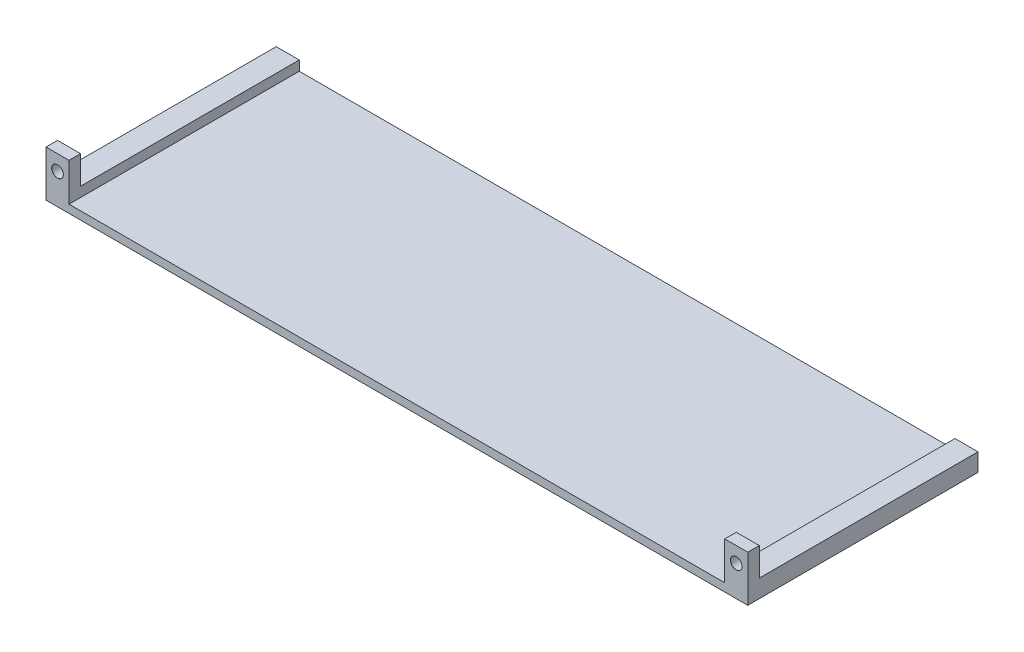
ISO-10303-21;
HEADER;
FILE_DESCRIPTION(('STEP AP214'),'2;1');
FILE_NAME('part.step','',(''),(''),'','','');
FILE_SCHEMA(('AUTOMOTIVE_DESIGN { 1 0 10303 214 1 1 1 1 }'));
ENDSEC;
DATA;
#1=APPLICATION_CONTEXT('core data for automotive mechanical design processes');
#2=APPLICATION_PROTOCOL_DEFINITION('international standard','automotive_design',2000,#1);
#3=PRODUCT_CONTEXT('',#1,'mechanical');
#4=PRODUCT('Part','Part','',(#3));
#5=PRODUCT_RELATED_PRODUCT_CATEGORY('part','',(#4));
#6=PRODUCT_DEFINITION_FORMATION('','',#4);
#7=PRODUCT_DEFINITION_CONTEXT('part definition',#1,'design');
#8=PRODUCT_DEFINITION('design','',#6,#7);
#9=PRODUCT_DEFINITION_SHAPE('','',#8);
#10=(LENGTH_UNIT() NAMED_UNIT(*) SI_UNIT(.MILLI.,.METRE.));
#11=(NAMED_UNIT(*) PLANE_ANGLE_UNIT() SI_UNIT($,.RADIAN.));
#12=(NAMED_UNIT(*) SI_UNIT($,.STERADIAN.) SOLID_ANGLE_UNIT());
#13=UNCERTAINTY_MEASURE_WITH_UNIT(LENGTH_MEASURE(1.E-05),#10,'distance_accuracy_value','');
#14=(GEOMETRIC_REPRESENTATION_CONTEXT(3) GLOBAL_UNCERTAINTY_ASSIGNED_CONTEXT((#13)) GLOBAL_UNIT_ASSIGNED_CONTEXT((#10,
#11,#12)) REPRESENTATION_CONTEXT('',''));
#15=CARTESIAN_POINT('',(0.,0.,0.));
#16=DIRECTION('',(0.,0.,1.));
#17=DIRECTION('',(1.,0.,0.));
#18=AXIS2_PLACEMENT_3D('',#15,#16,#17);
#19=CARTESIAN_POINT('',(0.,0.,-100.));
#20=DIRECTION('',(0.,0.,1.));
#21=DIRECTION('',(1.,0.,0.));
#22=AXIS2_PLACEMENT_3D('',#19,#20,#21);
#23=PLANE('',#22);
#24=DIRECTION('',(-1.,0.,0.));
#25=VECTOR('',#24,1.);
#26=CARTESIAN_POINT('',(-142.4,-36.4899999999999,-100.));
#27=LINE('',#26,#25);
#28=CARTESIAN_POINT('',(-142.4,-36.4899999999999,-100.));
#29=VERTEX_POINT('',#28);
#30=CARTESIAN_POINT('',(-152.4,-36.4899999999999,-100.));
#31=VERTEX_POINT('',#30);
#32=EDGE_CURVE('E133',#29,#31,#27,.T.);
#33=ORIENTED_EDGE('',*,*,#32,.F.);
#34=DIRECTION('',(0.,1.,0.));
#35=VECTOR('',#34,1.);
#36=CARTESIAN_POINT('',(-142.4,0.,-100.));
#37=LINE('',#36,#35);
#38=CARTESIAN_POINT('',(-142.4,-40.74,-100.));
#39=VERTEX_POINT('',#38);
#40=EDGE_CURVE('E144',#39,#29,#37,.T.);
#41=ORIENTED_EDGE('',*,*,#40,.F.);
#42=DIRECTION('',(1.,0.,0.));
#43=VECTOR('',#42,1.);
#44=CARTESIAN_POINT('',(0.,-40.74,-100.));
#45=LINE('',#44,#43);
#46=CARTESIAN_POINT('',(142.4,-40.7399999999999,-100.));
#47=VERTEX_POINT('',#46);
#48=EDGE_CURVE('E154',#39,#47,#45,.T.);
#49=ORIENTED_EDGE('',*,*,#48,.T.);
#50=DIRECTION('',(0.,1.,0.));
#51=VECTOR('',#50,1.);
#52=CARTESIAN_POINT('',(142.4,0.,-100.));
#53=LINE('',#52,#51);
#54=CARTESIAN_POINT('',(142.4,-36.4899999999999,-100.));
#55=VERTEX_POINT('',#54);
#56=EDGE_CURVE('E158',#47,#55,#53,.T.);
#57=ORIENTED_EDGE('',*,*,#56,.T.);
#58=DIRECTION('',(1.,0.,0.));
#59=VECTOR('',#58,1.);
#60=CARTESIAN_POINT('',(142.4,-36.4899999999999,-100.));
#61=LINE('',#60,#59);
#62=CARTESIAN_POINT('',(152.4,-36.4899999999999,-100.));
#63=VERTEX_POINT('',#62);
#64=EDGE_CURVE('E198',#55,#63,#61,.T.);
#65=ORIENTED_EDGE('',*,*,#64,.T.);
#66=DIRECTION('',(0.,1.,0.));
#67=VECTOR('',#66,1.);
#68=CARTESIAN_POINT('',(152.4,0.,-100.));
#69=LINE('',#68,#67);
#70=CARTESIAN_POINT('',(152.4,-44.2399999999999,-100.));
#71=VERTEX_POINT('',#70);
#72=EDGE_CURVE('E228',#71,#63,#69,.T.);
#73=ORIENTED_EDGE('',*,*,#72,.F.);
#74=DIRECTION('',(1.,0.,0.));
#75=VECTOR('',#74,1.);
#76=CARTESIAN_POINT('',(0.,-44.24,-100.));
#77=LINE('',#76,#75);
#78=CARTESIAN_POINT('',(-152.4,-44.24,-100.));
#79=VERTEX_POINT('',#78);
#80=EDGE_CURVE('E225',#79,#71,#77,.T.);
#81=ORIENTED_EDGE('',*,*,#80,.F.);
#82=DIRECTION('',(0.,1.,0.));
#83=VECTOR('',#82,1.);
#84=CARTESIAN_POINT('',(-152.4,0.,-100.));
#85=LINE('',#84,#83);
#86=EDGE_CURVE('E147',#79,#31,#85,.T.);
#87=ORIENTED_EDGE('',*,*,#86,.T.);
#88=EDGE_LOOP('',(#33,#41,#49,#57,#65,#73,#81,#87));
#89=FACE_BOUND('',#88,.T.);
#90=ADVANCED_FACE('F41',(#89),#23,.F.);
#91=CARTESIAN_POINT('',(-152.4,0.,-100.));
#92=DIRECTION('',(1.,0.,0.));
#93=DIRECTION('',(0.,0.,-1.));
#94=AXIS2_PLACEMENT_3D('',#91,#92,#93);
#95=PLANE('',#94);
#96=DIRECTION('',(0.,-1.,0.));
#97=VECTOR('',#96,1.);
#98=CARTESIAN_POINT('',(-152.4,-24.24,-5.));
#99=LINE('',#98,#97);
#100=CARTESIAN_POINT('',(-152.4,-24.24,-5.));
#101=VERTEX_POINT('',#100);
#102=CARTESIAN_POINT('',(-152.4,-36.49,-5.));
#103=VERTEX_POINT('',#102);
#104=EDGE_CURVE('E139',#101,#103,#99,.T.);
#105=ORIENTED_EDGE('',*,*,#104,.T.);
#106=DIRECTION('',(0.,0.,-1.));
#107=VECTOR('',#106,1.);
#108=CARTESIAN_POINT('',(-152.4,-36.4899999999999,-100.));
#109=LINE('',#108,#107);
#110=EDGE_CURVE('E257',#103,#31,#109,.T.);
#111=ORIENTED_EDGE('',*,*,#110,.T.);
#112=ORIENTED_EDGE('',*,*,#86,.F.);
#113=DIRECTION('',(0.,0.,1.));
#114=VECTOR('',#113,1.);
#115=CARTESIAN_POINT('',(-152.4,-44.24,-100.));
#116=LINE('',#115,#114);
#117=CARTESIAN_POINT('',(-152.4,-44.24,0.));
#118=VERTEX_POINT('',#117);
#119=EDGE_CURVE('E153',#79,#118,#116,.T.);
#120=ORIENTED_EDGE('',*,*,#119,.T.);
#121=DIRECTION('',(0.,1.,0.));
#122=VECTOR('',#121,1.);
#123=CARTESIAN_POINT('',(-152.4,0.,0.));
#124=LINE('',#123,#122);
#125=CARTESIAN_POINT('',(-152.4,-24.24,0.));
#126=VERTEX_POINT('',#125);
#127=EDGE_CURVE('E162',#118,#126,#124,.T.);
#128=ORIENTED_EDGE('',*,*,#127,.T.);
#129=DIRECTION('',(0.,0.,1.));
#130=VECTOR('',#129,1.);
#131=CARTESIAN_POINT('',(-152.4,-24.24,-100.));
#132=LINE('',#131,#130);
#133=EDGE_CURVE('E11',#101,#126,#132,.T.);
#134=ORIENTED_EDGE('',*,*,#133,.F.);
#135=EDGE_LOOP('',(#105,#111,#112,#120,#128,#134));
#136=FACE_BOUND('',#135,.T.);
#137=ADVANCED_FACE('F43',(#136),#95,.F.);
#138=CARTESIAN_POINT('',(0.,-24.24,-100.));
#139=DIRECTION('',(0.,-1.,0.));
#140=DIRECTION('',(0.,0.,-1.));
#141=AXIS2_PLACEMENT_3D('',#138,#139,#140);
#142=PLANE('',#141);
#143=DIRECTION('',(-1.,0.,0.));
#144=VECTOR('',#143,1.);
#145=CARTESIAN_POINT('',(-142.4,-24.24,-5.));
#146=LINE('',#145,#144);
#147=CARTESIAN_POINT('',(-142.4,-24.24,-5.));
#148=VERTEX_POINT('',#147);
#149=EDGE_CURVE('E245',#148,#101,#146,.T.);
#150=ORIENTED_EDGE('',*,*,#149,.T.);
#151=ORIENTED_EDGE('',*,*,#133,.T.);
#152=DIRECTION('',(1.,0.,0.));
#153=VECTOR('',#152,1.);
#154=CARTESIAN_POINT('',(0.,-24.24,0.));
#155=LINE('',#154,#153);
#156=CARTESIAN_POINT('',(-142.4,-24.24,0.));
#157=VERTEX_POINT('',#156);
#158=EDGE_CURVE('E183',#126,#157,#155,.T.);
#159=ORIENTED_EDGE('',*,*,#158,.T.);
#160=DIRECTION('',(0.,0.,1.));
#161=VECTOR('',#160,1.);
#162=CARTESIAN_POINT('',(-142.4,-24.24,-100.));
#163=LINE('',#162,#161);
#164=EDGE_CURVE('E50',#148,#157,#163,.T.);
#165=ORIENTED_EDGE('',*,*,#164,.F.);
#166=EDGE_LOOP('',(#150,#151,#159,#165));
#167=FACE_BOUND('',#166,.T.);
#168=ADVANCED_FACE('F261',(#167),#142,.F.);
#169=CARTESIAN_POINT('',(-142.4,0.,-100.));
#170=DIRECTION('',(1.,0.,0.));
#171=DIRECTION('',(0.,0.,-1.));
#172=AXIS2_PLACEMENT_3D('',#169,#170,#171);
#173=PLANE('',#172);
#174=DIRECTION('',(0.,0.,-1.));
#175=VECTOR('',#174,1.);
#176=CARTESIAN_POINT('',(-142.4,-36.4899999999999,-100.));
#177=LINE('',#176,#175);
#178=CARTESIAN_POINT('',(-142.4,-36.49,-5.));
#179=VERTEX_POINT('',#178);
#180=EDGE_CURVE('E130',#179,#29,#177,.T.);
#181=ORIENTED_EDGE('',*,*,#180,.F.);
#182=DIRECTION('',(0.,-1.,0.));
#183=VECTOR('',#182,1.);
#184=CARTESIAN_POINT('',(-142.4,-24.24,-5.));
#185=LINE('',#184,#183);
#186=EDGE_CURVE('E138',#148,#179,#185,.T.);
#187=ORIENTED_EDGE('',*,*,#186,.F.);
#188=ORIENTED_EDGE('',*,*,#164,.T.);
#189=DIRECTION('',(0.,1.,0.));
#190=VECTOR('',#189,1.);
#191=CARTESIAN_POINT('',(-142.4,0.,0.));
#192=LINE('',#191,#190);
#193=CARTESIAN_POINT('',(-142.4,-40.74,0.));
#194=VERTEX_POINT('',#193);
#195=EDGE_CURVE('E180',#194,#157,#192,.T.);
#196=ORIENTED_EDGE('',*,*,#195,.F.);
#197=DIRECTION('',(0.,0.,1.));
#198=VECTOR('',#197,1.);
#199=CARTESIAN_POINT('',(-142.4,-40.74,-100.));
#200=LINE('',#199,#198);
#201=EDGE_CURVE('E151',#39,#194,#200,.T.);
#202=ORIENTED_EDGE('',*,*,#201,.F.);
#203=ORIENTED_EDGE('',*,*,#40,.T.);
#204=EDGE_LOOP('',(#181,#187,#188,#196,#202,#203));
#205=FACE_BOUND('',#204,.T.);
#206=ADVANCED_FACE('F149',(#205),#173,.T.);
#207=CARTESIAN_POINT('',(-147.4,-30.9066666666667,0.));
#208=DIRECTION('',(0.,0.,1.));
#209=DIRECTION('',(1.,0.,0.));
#210=AXIS2_PLACEMENT_3D('',#207,#208,#209);
#211=CYLINDRICAL_SURFACE('',#210,2.49999999999999);
#212=CARTESIAN_POINT('',(-147.4,-30.9066666666667,-0.025));
#213=DIRECTION('',(0.,0.,1.));
#214=DIRECTION('',(1.,0.,0.));
#215=AXIS2_PLACEMENT_3D('',#212,#213,#214);
#216=CIRCLE('',#215,2.5);
#217=CARTESIAN_POINT('',(-144.9,-30.9066666666667,-0.025));
#218=VERTEX_POINT('',#217);
#219=EDGE_CURVE('E202',#218,#218,#216,.T.);
#220=ORIENTED_EDGE('',*,*,#219,.T.);
#221=EDGE_LOOP('',(#220));
#222=FACE_BOUND('',#221,.T.);
#223=CARTESIAN_POINT('',(-147.4,-30.9066666666667,-5.));
#224=DIRECTION('',(0.,0.,-1.));
#225=DIRECTION('',(-1.,0.,0.));
#226=AXIS2_PLACEMENT_3D('',#223,#224,#225);
#227=CIRCLE('',#226,2.49999999999999);
#228=CARTESIAN_POINT('',(-149.9,-30.9066666666667,-5.));
#229=VERTEX_POINT('',#228);
#230=EDGE_CURVE('E45',#229,#229,#227,.F.);
#231=ORIENTED_EDGE('',*,*,#230,.F.);
#232=EDGE_LOOP('',(#231));
#233=FACE_BOUND('',#232,.T.);
#234=ADVANCED_FACE('F270',(#222,#233),#211,.F.);
#235=CARTESIAN_POINT('',(0.,-40.74,-100.));
#236=DIRECTION('',(0.,-1.,0.));
#237=DIRECTION('',(1.,0.,0.));
#238=AXIS2_PLACEMENT_3D('',#235,#236,#237);
#239=PLANE('',#238);
#240=DIRECTION('',(1.,0.,0.));
#241=VECTOR('',#240,1.);
#242=CARTESIAN_POINT('',(0.,-40.74,0.));
#243=LINE('',#242,#241);
#244=CARTESIAN_POINT('',(142.4,-40.7399999999999,0.));
#245=VERTEX_POINT('',#244);
#246=EDGE_CURVE('E178',#194,#245,#243,.T.);
#247=ORIENTED_EDGE('',*,*,#246,.T.);
#248=DIRECTION('',(0.,0.,1.));
#249=VECTOR('',#248,1.);
#250=CARTESIAN_POINT('',(142.4,-40.7399999999999,-100.));
#251=LINE('',#250,#249);
#252=EDGE_CURVE('E188',#47,#245,#251,.T.);
#253=ORIENTED_EDGE('',*,*,#252,.F.);
#254=ORIENTED_EDGE('',*,*,#48,.F.);
#255=ORIENTED_EDGE('',*,*,#201,.T.);
#256=EDGE_LOOP('',(#247,#253,#254,#255));
#257=FACE_BOUND('',#256,.T.);
#258=ADVANCED_FACE('F268',(#257),#239,.F.);
#259=CARTESIAN_POINT('',(142.4,0.,-100.));
#260=DIRECTION('',(1.,0.,0.));
#261=DIRECTION('',(0.,0.,-1.));
#262=AXIS2_PLACEMENT_3D('',#259,#260,#261);
#263=PLANE('',#262);
#264=DIRECTION('',(0.,-1.,0.));
#265=VECTOR('',#264,1.);
#266=CARTESIAN_POINT('',(142.4,-24.24,-5.));
#267=LINE('',#266,#265);
#268=CARTESIAN_POINT('',(142.4,-24.24,-5.));
#269=VERTEX_POINT('',#268);
#270=CARTESIAN_POINT('',(142.4,-36.49,-5.));
#271=VERTEX_POINT('',#270);
#272=EDGE_CURVE('E238',#269,#271,#267,.T.);
#273=ORIENTED_EDGE('',*,*,#272,.T.);
#274=DIRECTION('',(0.,0.,-1.));
#275=VECTOR('',#274,1.);
#276=CARTESIAN_POINT('',(142.4,-36.4899999999999,-100.));
#277=LINE('',#276,#275);
#278=EDGE_CURVE('E215',#271,#55,#277,.T.);
#279=ORIENTED_EDGE('',*,*,#278,.T.);
#280=ORIENTED_EDGE('',*,*,#56,.F.);
#281=ORIENTED_EDGE('',*,*,#252,.T.);
#282=DIRECTION('',(0.,1.,0.));
#283=VECTOR('',#282,1.);
#284=CARTESIAN_POINT('',(142.4,0.,0.));
#285=LINE('',#284,#283);
#286=CARTESIAN_POINT('',(142.4,-24.2399999999999,0.));
#287=VERTEX_POINT('',#286);
#288=EDGE_CURVE('E175',#245,#287,#285,.T.);
#289=ORIENTED_EDGE('',*,*,#288,.T.);
#290=DIRECTION('',(0.,0.,1.));
#291=VECTOR('',#290,1.);
#292=CARTESIAN_POINT('',(142.4,-24.2399999999999,-100.));
#293=LINE('',#292,#291);
#294=EDGE_CURVE('E191',#269,#287,#293,.T.);
#295=ORIENTED_EDGE('',*,*,#294,.F.);
#296=EDGE_LOOP('',(#273,#279,#280,#281,#289,#295));
#297=FACE_BOUND('',#296,.T.);
#298=ADVANCED_FACE('F234',(#297),#263,.F.);
#299=CARTESIAN_POINT('',(0.,-24.2399999999999,-100.));
#300=DIRECTION('',(0.,1.,0.));
#301=DIRECTION('',(-1.,0.,0.));
#302=AXIS2_PLACEMENT_3D('',#299,#300,#301);
#303=PLANE('',#302);
#304=DIRECTION('',(1.,0.,0.));
#305=VECTOR('',#304,1.);
#306=CARTESIAN_POINT('',(142.4,-24.24,-5.));
#307=LINE('',#306,#305);
#308=CARTESIAN_POINT('',(152.4,-24.2399999999999,-5.));
#309=VERTEX_POINT('',#308);
#310=EDGE_CURVE('E66',#269,#309,#307,.T.);
#311=ORIENTED_EDGE('',*,*,#310,.F.);
#312=ORIENTED_EDGE('',*,*,#294,.T.);
#313=DIRECTION('',(-1.,0.,0.));
#314=VECTOR('',#313,1.);
#315=CARTESIAN_POINT('',(0.,-24.2399999999999,0.));
#316=LINE('',#315,#314);
#317=CARTESIAN_POINT('',(152.4,-24.2399999999999,0.));
#318=VERTEX_POINT('',#317);
#319=EDGE_CURVE('E172',#318,#287,#316,.T.);
#320=ORIENTED_EDGE('',*,*,#319,.F.);
#321=DIRECTION('',(0.,0.,1.));
#322=VECTOR('',#321,1.);
#323=CARTESIAN_POINT('',(152.4,-24.2399999999999,-100.));
#324=LINE('',#323,#322);
#325=EDGE_CURVE('E193',#309,#318,#324,.T.);
#326=ORIENTED_EDGE('',*,*,#325,.F.);
#327=EDGE_LOOP('',(#311,#312,#320,#326));
#328=FACE_BOUND('',#327,.T.);
#329=ADVANCED_FACE('F276',(#328),#303,.T.);
#330=CARTESIAN_POINT('',(152.4,0.,-100.));
#331=DIRECTION('',(1.,0.,0.));
#332=DIRECTION('',(0.,0.,-1.));
#333=AXIS2_PLACEMENT_3D('',#330,#331,#332);
#334=PLANE('',#333);
#335=DIRECTION('',(0.,0.,-1.));
#336=VECTOR('',#335,1.);
#337=CARTESIAN_POINT('',(152.4,-36.4899999999999,-100.));
#338=LINE('',#337,#336);
#339=CARTESIAN_POINT('',(152.4,-36.49,-5.));
#340=VERTEX_POINT('',#339);
#341=EDGE_CURVE('E212',#340,#63,#338,.T.);
#342=ORIENTED_EDGE('',*,*,#341,.F.);
#343=DIRECTION('',(0.,-1.,0.));
#344=VECTOR('',#343,1.);
#345=CARTESIAN_POINT('',(152.4,-24.24,-5.));
#346=LINE('',#345,#344);
#347=EDGE_CURVE('E242',#309,#340,#346,.T.);
#348=ORIENTED_EDGE('',*,*,#347,.F.);
#349=ORIENTED_EDGE('',*,*,#325,.T.);
#350=DIRECTION('',(0.,1.,0.));
#351=VECTOR('',#350,1.);
#352=CARTESIAN_POINT('',(152.4,0.,0.));
#353=LINE('',#352,#351);
#354=CARTESIAN_POINT('',(152.4,-44.2399999999999,0.));
#355=VERTEX_POINT('',#354);
#356=EDGE_CURVE('E169',#355,#318,#353,.T.);
#357=ORIENTED_EDGE('',*,*,#356,.F.);
#358=DIRECTION('',(0.,0.,1.));
#359=VECTOR('',#358,1.);
#360=CARTESIAN_POINT('',(152.4,-44.2399999999999,-100.));
#361=LINE('',#360,#359);
#362=EDGE_CURVE('E156',#71,#355,#361,.T.);
#363=ORIENTED_EDGE('',*,*,#362,.F.);
#364=ORIENTED_EDGE('',*,*,#72,.T.);
#365=EDGE_LOOP('',(#342,#348,#349,#357,#363,#364));
#366=FACE_BOUND('',#365,.T.);
#367=ADVANCED_FACE('F421',(#366),#334,.T.);
#368=CARTESIAN_POINT('',(0.,-44.24,-100.));
#369=DIRECTION('',(0.,-1.,0.));
#370=DIRECTION('',(1.,0.,0.));
#371=AXIS2_PLACEMENT_3D('',#368,#369,#370);
#372=PLANE('',#371);
#373=DIRECTION('',(1.,0.,0.));
#374=VECTOR('',#373,1.);
#375=CARTESIAN_POINT('',(0.,-44.24,0.));
#376=LINE('',#375,#374);
#377=EDGE_CURVE('E165',#118,#355,#376,.T.);
#378=ORIENTED_EDGE('',*,*,#377,.F.);
#379=ORIENTED_EDGE('',*,*,#119,.F.);
#380=ORIENTED_EDGE('',*,*,#80,.T.);
#381=ORIENTED_EDGE('',*,*,#362,.T.);
#382=EDGE_LOOP('',(#378,#379,#380,#381));
#383=FACE_BOUND('',#382,.T.);
#384=ADVANCED_FACE('F333',(#383),#372,.T.);
#385=CARTESIAN_POINT('',(0.,0.,0.));
#386=DIRECTION('',(0.,0.,1.));
#387=DIRECTION('',(1.,0.,0.));
#388=AXIS2_PLACEMENT_3D('',#385,#386,#387);
#389=PLANE('',#388);
#390=CARTESIAN_POINT('',(-147.4,-30.9066666666667,0.));
#391=DIRECTION('',(0.,0.,1.));
#392=DIRECTION('',(1.,0.,0.));
#393=AXIS2_PLACEMENT_3D('',#390,#391,#392);
#394=CIRCLE('',#393,2.525);
#395=CARTESIAN_POINT('',(-144.875,-30.9066666666667,0.));
#396=VERTEX_POINT('',#395);
#397=EDGE_CURVE('E197',#396,#396,#394,.T.);
#398=ORIENTED_EDGE('',*,*,#397,.F.);
#399=EDGE_LOOP('',(#398));
#400=FACE_BOUND('',#399,.T.);
#401=CARTESIAN_POINT('',(147.4,-30.9066666666663,0.));
#402=DIRECTION('',(0.,0.,1.));
#403=DIRECTION('',(1.,0.,0.));
#404=AXIS2_PLACEMENT_3D('',#401,#402,#403);
#405=CIRCLE('',#404,2.525);
#406=CARTESIAN_POINT('',(149.925,-30.9066666666663,0.));
#407=VERTEX_POINT('',#406);
#408=EDGE_CURVE('E219',#407,#407,#405,.T.);
#409=ORIENTED_EDGE('',*,*,#408,.F.);
#410=EDGE_LOOP('',(#409));
#411=FACE_BOUND('',#410,.T.);
#412=ORIENTED_EDGE('',*,*,#127,.F.);
#413=ORIENTED_EDGE('',*,*,#377,.T.);
#414=ORIENTED_EDGE('',*,*,#356,.T.);
#415=ORIENTED_EDGE('',*,*,#319,.T.);
#416=ORIENTED_EDGE('',*,*,#288,.F.);
#417=ORIENTED_EDGE('',*,*,#246,.F.);
#418=ORIENTED_EDGE('',*,*,#195,.T.);
#419=ORIENTED_EDGE('',*,*,#158,.F.);
#420=EDGE_LOOP('',(#412,#413,#414,#415,#416,#417,#418,#419));
#421=FACE_BOUND('',#420,.T.);
#422=ADVANCED_FACE('F266',(#400,#411,#421),#389,.T.);
#423=CARTESIAN_POINT('',(147.4,-30.9066666666663,0.));
#424=DIRECTION('',(0.,0.,1.));
#425=DIRECTION('',(1.,0.,0.));
#426=AXIS2_PLACEMENT_3D('',#423,#424,#425);
#427=CYLINDRICAL_SURFACE('',#426,2.49999999999999);
#428=CARTESIAN_POINT('',(147.4,-30.9066666666663,-5.));
#429=DIRECTION('',(0.,0.,1.));
#430=DIRECTION('',(1.,0.,0.));
#431=AXIS2_PLACEMENT_3D('',#428,#429,#430);
#432=CIRCLE('',#431,2.49999999999999);
#433=CARTESIAN_POINT('',(149.9,-30.9066666666663,-5.));
#434=VERTEX_POINT('',#433);
#435=EDGE_CURVE('E195',#434,#434,#432,.F.);
#436=ORIENTED_EDGE('',*,*,#435,.T.);
#437=EDGE_LOOP('',(#436));
#438=FACE_BOUND('',#437,.T.);
#439=CARTESIAN_POINT('',(147.4,-30.9066666666663,-0.025));
#440=DIRECTION('',(0.,0.,1.));
#441=DIRECTION('',(1.,0.,0.));
#442=AXIS2_PLACEMENT_3D('',#439,#440,#441);
#443=CIRCLE('',#442,2.5);
#444=CARTESIAN_POINT('',(149.9,-30.9066666666663,-0.025));
#445=VERTEX_POINT('',#444);
#446=EDGE_CURVE('E166',#445,#445,#443,.T.);
#447=ORIENTED_EDGE('',*,*,#446,.T.);
#448=EDGE_LOOP('',(#447));
#449=FACE_BOUND('',#448,.T.);
#450=ADVANCED_FACE('F289',(#438,#449),#427,.F.);
#451=CARTESIAN_POINT('',(147.4,-30.9066666666663,0.));
#452=DIRECTION('',(0.,0.,1.));
#453=DIRECTION('',(1.,0.,0.));
#454=AXIS2_PLACEMENT_3D('',#451,#452,#453);
#455=CONICAL_SURFACE('',#454,2.525,0.785398163397359);
#456=ORIENTED_EDGE('',*,*,#446,.F.);
#457=EDGE_LOOP('',(#456));
#458=FACE_BOUND('',#457,.T.);
#459=ORIENTED_EDGE('',*,*,#408,.T.);
#460=EDGE_LOOP('',(#459));
#461=FACE_BOUND('',#460,.T.);
#462=ADVANCED_FACE('F413',(#458,#461),#455,.F.);
#463=CARTESIAN_POINT('',(-147.4,-30.9066666666667,0.));
#464=DIRECTION('',(0.,0.,1.));
#465=DIRECTION('',(1.,0.,0.));
#466=AXIS2_PLACEMENT_3D('',#463,#464,#465);
#467=CONICAL_SURFACE('',#466,2.525,0.785398163397359);
#468=ORIENTED_EDGE('',*,*,#219,.F.);
#469=EDGE_LOOP('',(#468));
#470=FACE_BOUND('',#469,.T.);
#471=ORIENTED_EDGE('',*,*,#397,.T.);
#472=EDGE_LOOP('',(#471));
#473=FACE_BOUND('',#472,.T.);
#474=ADVANCED_FACE('F346',(#470,#473),#467,.F.);
#475=CARTESIAN_POINT('',(142.4,-24.24,-5.));
#476=DIRECTION('',(0.,0.,1.));
#477=DIRECTION('',(1.,0.,0.));
#478=AXIS2_PLACEMENT_3D('',#475,#476,#477);
#479=PLANE('',#478);
#480=ORIENTED_EDGE('',*,*,#347,.T.);
#481=DIRECTION('',(1.,0.,0.));
#482=VECTOR('',#481,1.);
#483=CARTESIAN_POINT('',(142.4,-36.49,-5.));
#484=LINE('',#483,#482);
#485=EDGE_CURVE('E205',#271,#340,#484,.T.);
#486=ORIENTED_EDGE('',*,*,#485,.F.);
#487=ORIENTED_EDGE('',*,*,#272,.F.);
#488=ORIENTED_EDGE('',*,*,#310,.T.);
#489=EDGE_LOOP('',(#480,#486,#487,#488));
#490=FACE_BOUND('',#489,.T.);
#491=ORIENTED_EDGE('',*,*,#435,.F.);
#492=EDGE_LOOP('',(#491));
#493=FACE_BOUND('',#492,.T.);
#494=ADVANCED_FACE('F341',(#490,#493),#479,.F.);
#495=CARTESIAN_POINT('',(142.4,-36.4899999999999,-100.));
#496=DIRECTION('',(0.,-1.,0.));
#497=DIRECTION('',(0.,0.,-1.));
#498=AXIS2_PLACEMENT_3D('',#495,#496,#497);
#499=PLANE('',#498);
#500=ORIENTED_EDGE('',*,*,#341,.T.);
#501=ORIENTED_EDGE('',*,*,#64,.F.);
#502=ORIENTED_EDGE('',*,*,#278,.F.);
#503=ORIENTED_EDGE('',*,*,#485,.T.);
#504=EDGE_LOOP('',(#500,#501,#502,#503));
#505=FACE_BOUND('',#504,.T.);
#506=ADVANCED_FACE('F311',(#505),#499,.F.);
#507=CARTESIAN_POINT('',(-142.4,-24.24,-5.));
#508=DIRECTION('',(0.,0.,-1.));
#509=DIRECTION('',(-1.,0.,0.));
#510=AXIS2_PLACEMENT_3D('',#507,#508,#509);
#511=PLANE('',#510);
#512=ORIENTED_EDGE('',*,*,#104,.F.);
#513=ORIENTED_EDGE('',*,*,#149,.F.);
#514=ORIENTED_EDGE('',*,*,#186,.T.);
#515=DIRECTION('',(-1.,0.,0.));
#516=VECTOR('',#515,1.);
#517=CARTESIAN_POINT('',(-142.4,-36.49,-5.));
#518=LINE('',#517,#516);
#519=EDGE_CURVE('E58',#179,#103,#518,.T.);
#520=ORIENTED_EDGE('',*,*,#519,.T.);
#521=EDGE_LOOP('',(#512,#513,#514,#520));
#522=FACE_BOUND('',#521,.T.);
#523=ORIENTED_EDGE('',*,*,#230,.T.);
#524=EDGE_LOOP('',(#523));
#525=FACE_BOUND('',#524,.T.);
#526=ADVANCED_FACE('F260',(#522,#525),#511,.T.);
#527=CARTESIAN_POINT('',(-142.4,-36.4899999999999,-100.));
#528=DIRECTION('',(0.,1.,0.));
#529=DIRECTION('',(0.,0.,1.));
#530=AXIS2_PLACEMENT_3D('',#527,#528,#529);
#531=PLANE('',#530);
#532=ORIENTED_EDGE('',*,*,#110,.F.);
#533=ORIENTED_EDGE('',*,*,#519,.F.);
#534=ORIENTED_EDGE('',*,*,#180,.T.);
#535=ORIENTED_EDGE('',*,*,#32,.T.);
#536=EDGE_LOOP('',(#532,#533,#534,#535));
#537=FACE_BOUND('',#536,.T.);
#538=ADVANCED_FACE('F132',(#537),#531,.T.);
#539=CLOSED_SHELL('',(#90,#137,#168,#206,#234,#258,#298,#329,#367,#384,#422,#450,#462,#474,#494,
#506,#526,#538));
#540=MANIFOLD_SOLID_BREP('B2',#539);
#541=ADVANCED_BREP_SHAPE_REPRESENTATION('',(#18,#540),#14);
#542=SHAPE_DEFINITION_REPRESENTATION(#9,#541);
ENDSEC;
END-ISO-10303-21;
